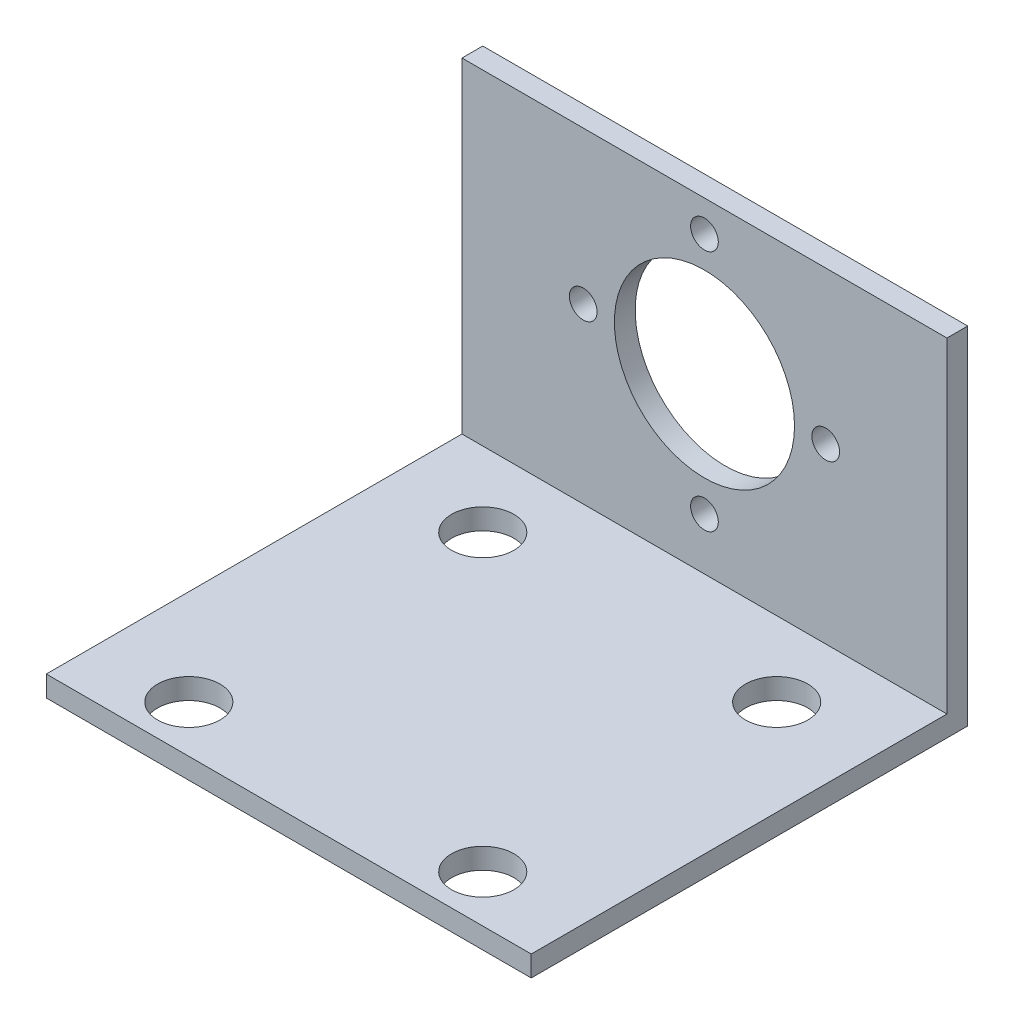
ISO-10303-21;
HEADER;
FILE_DESCRIPTION(('STEP AP214'),'2;1');
FILE_NAME('part.step','',(''),(''),'','','');
FILE_SCHEMA(('AUTOMOTIVE_DESIGN { 1 0 10303 214 1 1 1 1 }'));
ENDSEC;
DATA;
#1=APPLICATION_CONTEXT('core data for automotive mechanical design processes');
#2=APPLICATION_PROTOCOL_DEFINITION('international standard','automotive_design',2000,#1);
#3=PRODUCT_CONTEXT('',#1,'mechanical');
#4=PRODUCT('Part','Part','',(#3));
#5=PRODUCT_RELATED_PRODUCT_CATEGORY('part','',(#4));
#6=PRODUCT_DEFINITION_FORMATION('','',#4);
#7=PRODUCT_DEFINITION_CONTEXT('part definition',#1,'design');
#8=PRODUCT_DEFINITION('design','',#6,#7);
#9=PRODUCT_DEFINITION_SHAPE('','',#8);
#10=(LENGTH_UNIT() NAMED_UNIT(*) SI_UNIT(.MILLI.,.METRE.));
#11=(NAMED_UNIT(*) PLANE_ANGLE_UNIT() SI_UNIT($,.RADIAN.));
#12=(NAMED_UNIT(*) SI_UNIT($,.STERADIAN.) SOLID_ANGLE_UNIT());
#13=UNCERTAINTY_MEASURE_WITH_UNIT(LENGTH_MEASURE(1.E-05),#10,'distance_accuracy_value','');
#14=(GEOMETRIC_REPRESENTATION_CONTEXT(3) GLOBAL_UNCERTAINTY_ASSIGNED_CONTEXT((#13)) GLOBAL_UNIT_ASSIGNED_CONTEXT((#10,
#11,#12)) REPRESENTATION_CONTEXT('',''));
#15=CARTESIAN_POINT('',(0.,0.,0.));
#16=DIRECTION('',(0.,0.,1.));
#17=DIRECTION('',(1.,0.,0.));
#18=AXIS2_PLACEMENT_3D('',#15,#16,#17);
#19=CARTESIAN_POINT('',(0.,0.,3.));
#20=DIRECTION('',(0.,0.,1.));
#21=DIRECTION('',(1.,0.,0.));
#22=AXIS2_PLACEMENT_3D('',#19,#20,#21);
#23=PLANE('',#22);
#24=DIRECTION('',(-1.,0.,0.));
#25=VECTOR('',#24,1.);
#26=CARTESIAN_POINT('',(-35.,-25.,3.));
#27=LINE('',#26,#25);
#28=CARTESIAN_POINT('',(35.,-25.,3.));
#29=VERTEX_POINT('',#28);
#30=CARTESIAN_POINT('',(-35.,-25.,3.));
#31=VERTEX_POINT('',#30);
#32=EDGE_CURVE('E50',#29,#31,#27,.T.);
#33=ORIENTED_EDGE('',*,*,#32,.F.);
#34=DIRECTION('',(0.,1.,0.));
#35=VECTOR('',#34,1.);
#36=CARTESIAN_POINT('',(35.,22.,3.));
#37=LINE('',#36,#35);
#38=CARTESIAN_POINT('',(35.,22.,3.));
#39=VERTEX_POINT('',#38);
#40=EDGE_CURVE('E100',#29,#39,#37,.T.);
#41=ORIENTED_EDGE('',*,*,#40,.T.);
#42=DIRECTION('',(-1.,0.,0.));
#43=VECTOR('',#42,1.);
#44=CARTESIAN_POINT('',(-35.,22.,3.));
#45=LINE('',#44,#43);
#46=CARTESIAN_POINT('',(-35.,22.,3.));
#47=VERTEX_POINT('',#46);
#48=EDGE_CURVE('E56',#39,#47,#45,.T.);
#49=ORIENTED_EDGE('',*,*,#48,.T.);
#50=DIRECTION('',(0.,-1.,0.));
#51=VECTOR('',#50,1.);
#52=CARTESIAN_POINT('',(-35.,22.,3.));
#53=LINE('',#52,#51);
#54=EDGE_CURVE('E94',#47,#31,#53,.T.);
#55=ORIENTED_EDGE('',*,*,#54,.T.);
#56=EDGE_LOOP('',(#33,#41,#49,#55));
#57=FACE_BOUND('',#56,.T.);
#58=CARTESIAN_POINT('',(9.88330434368617E-13,-17.5,3.));
#59=DIRECTION('',(0.,0.,1.));
#60=DIRECTION('',(1.,0.,0.));
#61=AXIS2_PLACEMENT_3D('',#58,#59,#60);
#62=CIRCLE('',#61,2.00000000000106);
#63=CARTESIAN_POINT('',(2.00000000000205,-17.5,3.));
#64=VERTEX_POINT('',#63);
#65=EDGE_CURVE('E134',#64,#64,#62,.T.);
#66=ORIENTED_EDGE('',*,*,#65,.F.);
#67=EDGE_LOOP('',(#66));
#68=FACE_BOUND('',#67,.T.);
#69=CARTESIAN_POINT('',(0.,17.5,3.));
#70=DIRECTION('',(0.,0.,1.));
#71=DIRECTION('',(1.,0.,0.));
#72=AXIS2_PLACEMENT_3D('',#69,#70,#71);
#73=CIRCLE('',#72,2.);
#74=CARTESIAN_POINT('',(2.,17.5,3.));
#75=VERTEX_POINT('',#74);
#76=EDGE_CURVE('E122',#75,#75,#73,.T.);
#77=ORIENTED_EDGE('',*,*,#76,.F.);
#78=EDGE_LOOP('',(#77));
#79=FACE_BOUND('',#78,.T.);
#80=CARTESIAN_POINT('',(0.,0.,3.));
#81=DIRECTION('',(0.,0.,1.));
#82=DIRECTION('',(1.,0.,0.));
#83=AXIS2_PLACEMENT_3D('',#80,#81,#82);
#84=CIRCLE('',#83,13.);
#85=CARTESIAN_POINT('',(13.,0.,3.));
#86=VERTEX_POINT('',#85);
#87=EDGE_CURVE('E85',#86,#86,#84,.T.);
#88=ORIENTED_EDGE('',*,*,#87,.F.);
#89=EDGE_LOOP('',(#88));
#90=FACE_BOUND('',#89,.T.);
#91=CARTESIAN_POINT('',(17.5000000000005,4.94165217184309E-13,3.));
#92=DIRECTION('',(0.,0.,1.));
#93=DIRECTION('',(1.,0.,0.));
#94=AXIS2_PLACEMENT_3D('',#91,#92,#93);
#95=CIRCLE('',#94,2.00000000000039);
#96=CARTESIAN_POINT('',(19.5000000000009,4.94165217184309E-13,3.));
#97=VERTEX_POINT('',#96);
#98=EDGE_CURVE('E128',#97,#97,#95,.T.);
#99=ORIENTED_EDGE('',*,*,#98,.F.);
#100=EDGE_LOOP('',(#99));
#101=FACE_BOUND('',#100,.T.);
#102=CARTESIAN_POINT('',(-17.4999999999995,-4.96308349082816E-13,3.));
#103=DIRECTION('',(0.,0.,1.));
#104=DIRECTION('',(1.,0.,0.));
#105=AXIS2_PLACEMENT_3D('',#102,#103,#104);
#106=CIRCLE('',#105,2.00000000000079);
#107=CARTESIAN_POINT('',(-15.4999999999987,-4.96308349082816E-13,3.));
#108=VERTEX_POINT('',#107);
#109=EDGE_CURVE('E140',#108,#108,#106,.T.);
#110=ORIENTED_EDGE('',*,*,#109,.F.);
#111=EDGE_LOOP('',(#110));
#112=FACE_BOUND('',#111,.T.);
#113=ADVANCED_FACE('F35',(#57,#68,#79,#90,#101,#112),#23,.T.);
#114=CARTESIAN_POINT('',(0.,0.,0.));
#115=DIRECTION('',(0.,0.,1.));
#116=DIRECTION('',(1.,0.,0.));
#117=AXIS2_PLACEMENT_3D('',#114,#115,#116);
#118=PLANE('',#117);
#119=DIRECTION('',(0.,-1.,0.));
#120=VECTOR('',#119,1.);
#121=CARTESIAN_POINT('',(-35.,0.,0.));
#122=LINE('',#121,#120);
#123=CARTESIAN_POINT('',(-35.,22.,0.));
#124=VERTEX_POINT('',#123);
#125=CARTESIAN_POINT('',(-35.,-28.,0.));
#126=VERTEX_POINT('',#125);
#127=EDGE_CURVE('E75',#124,#126,#122,.T.);
#128=ORIENTED_EDGE('',*,*,#127,.F.);
#129=DIRECTION('',(-1.,0.,0.));
#130=VECTOR('',#129,1.);
#131=CARTESIAN_POINT('',(-35.,22.,0.));
#132=LINE('',#131,#130);
#133=CARTESIAN_POINT('',(35.,22.,0.));
#134=VERTEX_POINT('',#133);
#135=EDGE_CURVE('E80',#134,#124,#132,.T.);
#136=ORIENTED_EDGE('',*,*,#135,.F.);
#137=DIRECTION('',(0.,1.,0.));
#138=VECTOR('',#137,1.);
#139=CARTESIAN_POINT('',(35.,22.,0.));
#140=LINE('',#139,#138);
#141=CARTESIAN_POINT('',(35.,-28.,0.));
#142=VERTEX_POINT('',#141);
#143=EDGE_CURVE('E95',#142,#134,#140,.T.);
#144=ORIENTED_EDGE('',*,*,#143,.F.);
#145=DIRECTION('',(1.,0.,0.));
#146=VECTOR('',#145,1.);
#147=CARTESIAN_POINT('',(-35.,-28.,0.));
#148=LINE('',#147,#146);
#149=EDGE_CURVE('E81',#126,#142,#148,.T.);
#150=ORIENTED_EDGE('',*,*,#149,.F.);
#151=EDGE_LOOP('',(#128,#136,#144,#150));
#152=FACE_BOUND('',#151,.T.);
#153=CARTESIAN_POINT('',(0.,0.,0.));
#154=DIRECTION('',(0.,0.,1.));
#155=DIRECTION('',(1.,0.,0.));
#156=AXIS2_PLACEMENT_3D('',#153,#154,#155);
#157=CIRCLE('',#156,13.);
#158=CARTESIAN_POINT('',(13.,0.,0.));
#159=VERTEX_POINT('',#158);
#160=EDGE_CURVE('E119',#159,#159,#157,.T.);
#161=ORIENTED_EDGE('',*,*,#160,.T.);
#162=EDGE_LOOP('',(#161));
#163=FACE_BOUND('',#162,.T.);
#164=CARTESIAN_POINT('',(0.,17.5,0.));
#165=DIRECTION('',(0.,0.,1.));
#166=DIRECTION('',(1.,0.,0.));
#167=AXIS2_PLACEMENT_3D('',#164,#165,#166);
#168=CIRCLE('',#167,2.);
#169=CARTESIAN_POINT('',(2.,17.5,0.));
#170=VERTEX_POINT('',#169);
#171=EDGE_CURVE('E125',#170,#170,#168,.T.);
#172=ORIENTED_EDGE('',*,*,#171,.T.);
#173=EDGE_LOOP('',(#172));
#174=FACE_BOUND('',#173,.T.);
#175=CARTESIAN_POINT('',(17.5000000000005,4.94165217184309E-13,0.));
#176=DIRECTION('',(0.,0.,1.));
#177=DIRECTION('',(1.,0.,0.));
#178=AXIS2_PLACEMENT_3D('',#175,#176,#177);
#179=CIRCLE('',#178,2.00000000000039);
#180=CARTESIAN_POINT('',(19.5000000000009,4.94165217184309E-13,0.));
#181=VERTEX_POINT('',#180);
#182=EDGE_CURVE('E131',#181,#181,#179,.T.);
#183=ORIENTED_EDGE('',*,*,#182,.T.);
#184=EDGE_LOOP('',(#183));
#185=FACE_BOUND('',#184,.T.);
#186=CARTESIAN_POINT('',(9.88330434368617E-13,-17.5,0.));
#187=DIRECTION('',(0.,0.,1.));
#188=DIRECTION('',(1.,0.,0.));
#189=AXIS2_PLACEMENT_3D('',#186,#187,#188);
#190=CIRCLE('',#189,2.00000000000106);
#191=CARTESIAN_POINT('',(2.00000000000205,-17.5,0.));
#192=VERTEX_POINT('',#191);
#193=EDGE_CURVE('E137',#192,#192,#190,.T.);
#194=ORIENTED_EDGE('',*,*,#193,.T.);
#195=EDGE_LOOP('',(#194));
#196=FACE_BOUND('',#195,.T.);
#197=CARTESIAN_POINT('',(-17.4999999999995,-4.96308349082816E-13,0.));
#198=DIRECTION('',(0.,0.,1.));
#199=DIRECTION('',(1.,0.,0.));
#200=AXIS2_PLACEMENT_3D('',#197,#198,#199);
#201=CIRCLE('',#200,2.00000000000079);
#202=CARTESIAN_POINT('',(-15.4999999999987,-4.96308349082816E-13,0.));
#203=VERTEX_POINT('',#202);
#204=EDGE_CURVE('E143',#203,#203,#201,.T.);
#205=ORIENTED_EDGE('',*,*,#204,.T.);
#206=EDGE_LOOP('',(#205));
#207=FACE_BOUND('',#206,.T.);
#208=ADVANCED_FACE('F77',(#152,#163,#174,#185,#196,#207),#118,.F.);
#209=CARTESIAN_POINT('',(-35.,0.,3.));
#210=DIRECTION('',(1.,0.,0.));
#211=DIRECTION('',(0.,0.,-1.));
#212=AXIS2_PLACEMENT_3D('',#209,#210,#211);
#213=PLANE('',#212);
#214=ORIENTED_EDGE('',*,*,#127,.T.);
#215=DIRECTION('',(0.,0.,-1.));
#216=VECTOR('',#215,1.);
#217=CARTESIAN_POINT('',(-35.,-28.,3.));
#218=LINE('',#217,#216);
#219=CARTESIAN_POINT('',(-35.,-28.,63.));
#220=VERTEX_POINT('',#219);
#221=EDGE_CURVE('E11',#220,#126,#218,.T.);
#222=ORIENTED_EDGE('',*,*,#221,.F.);
#223=DIRECTION('',(0.,-1.,0.));
#224=VECTOR('',#223,1.);
#225=CARTESIAN_POINT('',(-35.,-28.,63.));
#226=LINE('',#225,#224);
#227=CARTESIAN_POINT('',(-35.,-25.,63.));
#228=VERTEX_POINT('',#227);
#229=EDGE_CURVE('E155',#228,#220,#226,.T.);
#230=ORIENTED_EDGE('',*,*,#229,.F.);
#231=DIRECTION('',(0.,0.,-1.));
#232=VECTOR('',#231,1.);
#233=CARTESIAN_POINT('',(-35.,-25.,63.));
#234=LINE('',#233,#232);
#235=EDGE_CURVE('E151',#228,#31,#234,.T.);
#236=ORIENTED_EDGE('',*,*,#235,.T.);
#237=ORIENTED_EDGE('',*,*,#54,.F.);
#238=DIRECTION('',(0.,0.,-1.));
#239=VECTOR('',#238,1.);
#240=CARTESIAN_POINT('',(-35.,22.,3.));
#241=LINE('',#240,#239);
#242=EDGE_CURVE('E90',#47,#124,#241,.T.);
#243=ORIENTED_EDGE('',*,*,#242,.T.);
#244=EDGE_LOOP('',(#214,#222,#230,#236,#237,#243));
#245=FACE_BOUND('',#244,.T.);
#246=ADVANCED_FACE('F37',(#245),#213,.F.);
#247=CARTESIAN_POINT('',(-35.,-28.,3.));
#248=DIRECTION('',(0.,1.,0.));
#249=DIRECTION('',(-1.,0.,0.));
#250=AXIS2_PLACEMENT_3D('',#247,#248,#249);
#251=PLANE('',#250);
#252=CARTESIAN_POINT('',(-21.2132034355962,-28.,13.7867965644045));
#253=DIRECTION('',(0.,1.,0.));
#254=DIRECTION('',(0.,0.,1.));
#255=AXIS2_PLACEMENT_3D('',#252,#253,#254);
#256=CIRCLE('',#255,4.5);
#257=CARTESIAN_POINT('',(-21.2132034355962,-28.,18.2867965644045));
#258=VERTEX_POINT('',#257);
#259=EDGE_CURVE('E173',#258,#258,#256,.T.);
#260=ORIENTED_EDGE('',*,*,#259,.T.);
#261=EDGE_LOOP('',(#260));
#262=FACE_BOUND('',#261,.T.);
#263=CARTESIAN_POINT('',(-21.2132034355954,-28.,56.2132034355974));
#264=DIRECTION('',(0.,1.,0.));
#265=DIRECTION('',(0.,0.,1.));
#266=AXIS2_PLACEMENT_3D('',#263,#264,#265);
#267=CIRCLE('',#266,4.5);
#268=CARTESIAN_POINT('',(-21.2132034355954,-28.,60.7132034355974));
#269=VERTEX_POINT('',#268);
#270=EDGE_CURVE('E179',#269,#269,#267,.T.);
#271=ORIENTED_EDGE('',*,*,#270,.T.);
#272=EDGE_LOOP('',(#271));
#273=FACE_BOUND('',#272,.T.);
#274=CARTESIAN_POINT('',(21.2132034355975,-28.,56.2132034355965));
#275=DIRECTION('',(0.,1.,0.));
#276=DIRECTION('',(0.,0.,1.));
#277=AXIS2_PLACEMENT_3D('',#274,#275,#276);
#278=CIRCLE('',#277,4.5);
#279=CARTESIAN_POINT('',(21.2132034355975,-28.,60.7132034355965));
#280=VERTEX_POINT('',#279);
#281=EDGE_CURVE('E167',#280,#280,#278,.T.);
#282=ORIENTED_EDGE('',*,*,#281,.T.);
#283=EDGE_LOOP('',(#282));
#284=FACE_BOUND('',#283,.T.);
#285=CARTESIAN_POINT('',(21.2132034355964,-28.,13.7867965644036));
#286=DIRECTION('',(0.,1.,0.));
#287=DIRECTION('',(0.,0.,1.));
#288=AXIS2_PLACEMENT_3D('',#285,#286,#287);
#289=CIRCLE('',#288,4.5);
#290=CARTESIAN_POINT('',(21.2132034355964,-28.,18.2867965644036));
#291=VERTEX_POINT('',#290);
#292=EDGE_CURVE('E156',#291,#291,#289,.T.);
#293=ORIENTED_EDGE('',*,*,#292,.T.);
#294=EDGE_LOOP('',(#293));
#295=FACE_BOUND('',#294,.T.);
#296=ORIENTED_EDGE('',*,*,#149,.T.);
#297=DIRECTION('',(0.,0.,-1.));
#298=VECTOR('',#297,1.);
#299=CARTESIAN_POINT('',(35.,-28.,3.));
#300=LINE('',#299,#298);
#301=CARTESIAN_POINT('',(35.,-28.,63.));
#302=VERTEX_POINT('',#301);
#303=EDGE_CURVE('E43',#302,#142,#300,.T.);
#304=ORIENTED_EDGE('',*,*,#303,.F.);
#305=DIRECTION('',(1.,0.,0.));
#306=VECTOR('',#305,1.);
#307=CARTESIAN_POINT('',(-35.,-28.,63.));
#308=LINE('',#307,#306);
#309=EDGE_CURVE('E160',#220,#302,#308,.T.);
#310=ORIENTED_EDGE('',*,*,#309,.F.);
#311=ORIENTED_EDGE('',*,*,#221,.T.);
#312=EDGE_LOOP('',(#296,#304,#310,#311));
#313=FACE_BOUND('',#312,.T.);
#314=ADVANCED_FACE('F188',(#262,#273,#284,#295,#313),#251,.F.);
#315=CARTESIAN_POINT('',(35.,22.,3.));
#316=DIRECTION('',(-1.,0.,0.));
#317=DIRECTION('',(0.,-1.,0.));
#318=AXIS2_PLACEMENT_3D('',#315,#316,#317);
#319=PLANE('',#318);
#320=ORIENTED_EDGE('',*,*,#143,.T.);
#321=DIRECTION('',(0.,0.,-1.));
#322=VECTOR('',#321,1.);
#323=CARTESIAN_POINT('',(35.,22.,3.));
#324=LINE('',#323,#322);
#325=EDGE_CURVE('E93',#39,#134,#324,.T.);
#326=ORIENTED_EDGE('',*,*,#325,.F.);
#327=ORIENTED_EDGE('',*,*,#40,.F.);
#328=DIRECTION('',(0.,0.,-1.));
#329=VECTOR('',#328,1.);
#330=CARTESIAN_POINT('',(35.,-25.,63.));
#331=LINE('',#330,#329);
#332=CARTESIAN_POINT('',(35.,-25.,63.));
#333=VERTEX_POINT('',#332);
#334=EDGE_CURVE('E146',#333,#29,#331,.T.);
#335=ORIENTED_EDGE('',*,*,#334,.F.);
#336=DIRECTION('',(0.,1.,0.));
#337=VECTOR('',#336,1.);
#338=CARTESIAN_POINT('',(35.,-28.,63.));
#339=LINE('',#338,#337);
#340=EDGE_CURVE('E111',#302,#333,#339,.T.);
#341=ORIENTED_EDGE('',*,*,#340,.F.);
#342=ORIENTED_EDGE('',*,*,#303,.T.);
#343=EDGE_LOOP('',(#320,#326,#327,#335,#341,#342));
#344=FACE_BOUND('',#343,.T.);
#345=ADVANCED_FACE('F107',(#344),#319,.F.);
#346=CARTESIAN_POINT('',(-35.,22.,3.));
#347=DIRECTION('',(0.,-1.,0.));
#348=DIRECTION('',(1.,0.,0.));
#349=AXIS2_PLACEMENT_3D('',#346,#347,#348);
#350=PLANE('',#349);
#351=ORIENTED_EDGE('',*,*,#135,.T.);
#352=ORIENTED_EDGE('',*,*,#242,.F.);
#353=ORIENTED_EDGE('',*,*,#48,.F.);
#354=ORIENTED_EDGE('',*,*,#325,.T.);
#355=EDGE_LOOP('',(#351,#352,#353,#354));
#356=FACE_BOUND('',#355,.T.);
#357=ADVANCED_FACE('F89',(#356),#350,.F.);
#358=CARTESIAN_POINT('',(0.,0.,3.));
#359=DIRECTION('',(0.,0.,-1.));
#360=DIRECTION('',(-1.,0.,0.));
#361=AXIS2_PLACEMENT_3D('',#358,#359,#360);
#362=CYLINDRICAL_SURFACE('',#361,13.);
#363=ORIENTED_EDGE('',*,*,#87,.T.);
#364=EDGE_LOOP('',(#363));
#365=FACE_BOUND('',#364,.T.);
#366=ORIENTED_EDGE('',*,*,#160,.F.);
#367=EDGE_LOOP('',(#366));
#368=FACE_BOUND('',#367,.T.);
#369=ADVANCED_FACE('F247',(#365,#368),#362,.F.);
#370=CARTESIAN_POINT('',(0.,17.5,3.));
#371=DIRECTION('',(0.,0.,-1.));
#372=DIRECTION('',(-1.,0.,0.));
#373=AXIS2_PLACEMENT_3D('',#370,#371,#372);
#374=CYLINDRICAL_SURFACE('',#373,2.);
#375=ORIENTED_EDGE('',*,*,#76,.T.);
#376=EDGE_LOOP('',(#375));
#377=FACE_BOUND('',#376,.T.);
#378=ORIENTED_EDGE('',*,*,#171,.F.);
#379=EDGE_LOOP('',(#378));
#380=FACE_BOUND('',#379,.T.);
#381=ADVANCED_FACE('F280',(#377,#380),#374,.F.);
#382=CARTESIAN_POINT('',(17.5000000000005,4.94165217184309E-13,3.));
#383=DIRECTION('',(0.,0.,-1.));
#384=DIRECTION('',(-1.,0.,0.));
#385=AXIS2_PLACEMENT_3D('',#382,#383,#384);
#386=CYLINDRICAL_SURFACE('',#385,2.00000000000039);
#387=ORIENTED_EDGE('',*,*,#98,.T.);
#388=EDGE_LOOP('',(#387));
#389=FACE_BOUND('',#388,.T.);
#390=ORIENTED_EDGE('',*,*,#182,.F.);
#391=EDGE_LOOP('',(#390));
#392=FACE_BOUND('',#391,.T.);
#393=ADVANCED_FACE('F276',(#389,#392),#386,.F.);
#394=CARTESIAN_POINT('',(9.88330434368617E-13,-17.5,3.));
#395=DIRECTION('',(0.,0.,-1.));
#396=DIRECTION('',(-1.,0.,0.));
#397=AXIS2_PLACEMENT_3D('',#394,#395,#396);
#398=CYLINDRICAL_SURFACE('',#397,2.00000000000106);
#399=ORIENTED_EDGE('',*,*,#65,.T.);
#400=EDGE_LOOP('',(#399));
#401=FACE_BOUND('',#400,.T.);
#402=ORIENTED_EDGE('',*,*,#193,.F.);
#403=EDGE_LOOP('',(#402));
#404=FACE_BOUND('',#403,.T.);
#405=ADVANCED_FACE('F234',(#401,#404),#398,.F.);
#406=CARTESIAN_POINT('',(-17.4999999999995,-4.96308349082816E-13,3.));
#407=DIRECTION('',(0.,0.,-1.));
#408=DIRECTION('',(-1.,0.,0.));
#409=AXIS2_PLACEMENT_3D('',#406,#407,#408);
#410=CYLINDRICAL_SURFACE('',#409,2.00000000000079);
#411=ORIENTED_EDGE('',*,*,#109,.T.);
#412=EDGE_LOOP('',(#411));
#413=FACE_BOUND('',#412,.T.);
#414=ORIENTED_EDGE('',*,*,#204,.F.);
#415=EDGE_LOOP('',(#414));
#416=FACE_BOUND('',#415,.T.);
#417=ADVANCED_FACE('F203',(#413,#416),#410,.F.);
#418=CARTESIAN_POINT('',(-35.,-25.,63.));
#419=DIRECTION('',(0.,-1.,0.));
#420=DIRECTION('',(0.,0.,-1.));
#421=AXIS2_PLACEMENT_3D('',#418,#419,#420);
#422=PLANE('',#421);
#423=CARTESIAN_POINT('',(-21.2132034355962,-25.,13.7867965644045));
#424=DIRECTION('',(0.,1.,0.));
#425=DIRECTION('',(0.,0.,1.));
#426=AXIS2_PLACEMENT_3D('',#423,#424,#425);
#427=CIRCLE('',#426,4.5);
#428=CARTESIAN_POINT('',(-21.2132034355962,-25.,18.2867965644045));
#429=VERTEX_POINT('',#428);
#430=EDGE_CURVE('E170',#429,#429,#427,.T.);
#431=ORIENTED_EDGE('',*,*,#430,.F.);
#432=EDGE_LOOP('',(#431));
#433=FACE_BOUND('',#432,.T.);
#434=CARTESIAN_POINT('',(-21.2132034355954,-25.,56.2132034355974));
#435=DIRECTION('',(0.,1.,0.));
#436=DIRECTION('',(0.,0.,1.));
#437=AXIS2_PLACEMENT_3D('',#434,#435,#436);
#438=CIRCLE('',#437,4.5);
#439=CARTESIAN_POINT('',(-21.2132034355954,-25.,60.7132034355974));
#440=VERTEX_POINT('',#439);
#441=EDGE_CURVE('E176',#440,#440,#438,.T.);
#442=ORIENTED_EDGE('',*,*,#441,.F.);
#443=EDGE_LOOP('',(#442));
#444=FACE_BOUND('',#443,.T.);
#445=CARTESIAN_POINT('',(21.2132034355975,-25.,56.2132034355965));
#446=DIRECTION('',(0.,1.,0.));
#447=DIRECTION('',(0.,0.,1.));
#448=AXIS2_PLACEMENT_3D('',#445,#446,#447);
#449=CIRCLE('',#448,4.5);
#450=CARTESIAN_POINT('',(21.2132034355975,-25.,60.7132034355965));
#451=VERTEX_POINT('',#450);
#452=EDGE_CURVE('E182',#451,#451,#449,.T.);
#453=ORIENTED_EDGE('',*,*,#452,.F.);
#454=EDGE_LOOP('',(#453));
#455=FACE_BOUND('',#454,.T.);
#456=CARTESIAN_POINT('',(21.2132034355964,-25.,13.7867965644036));
#457=DIRECTION('',(0.,1.,0.));
#458=DIRECTION('',(0.,0.,1.));
#459=AXIS2_PLACEMENT_3D('',#456,#457,#458);
#460=CIRCLE('',#459,4.5);
#461=CARTESIAN_POINT('',(21.2132034355964,-25.,18.2867965644036));
#462=VERTEX_POINT('',#461);
#463=EDGE_CURVE('E164',#462,#462,#460,.T.);
#464=ORIENTED_EDGE('',*,*,#463,.F.);
#465=EDGE_LOOP('',(#464));
#466=FACE_BOUND('',#465,.T.);
#467=ORIENTED_EDGE('',*,*,#32,.T.);
#468=ORIENTED_EDGE('',*,*,#235,.F.);
#469=DIRECTION('',(-1.,0.,0.));
#470=VECTOR('',#469,1.);
#471=CARTESIAN_POINT('',(-35.,-25.,63.));
#472=LINE('',#471,#470);
#473=EDGE_CURVE('E153',#333,#228,#472,.T.);
#474=ORIENTED_EDGE('',*,*,#473,.F.);
#475=ORIENTED_EDGE('',*,*,#334,.T.);
#476=EDGE_LOOP('',(#467,#468,#474,#475));
#477=FACE_BOUND('',#476,.T.);
#478=ADVANCED_FACE('F199',(#433,#444,#455,#466,#477),#422,.F.);
#479=CARTESIAN_POINT('',(0.,0.,63.));
#480=DIRECTION('',(0.,0.,-1.));
#481=DIRECTION('',(-1.,0.,0.));
#482=AXIS2_PLACEMENT_3D('',#479,#480,#481);
#483=PLANE('',#482);
#484=ORIENTED_EDGE('',*,*,#229,.T.);
#485=ORIENTED_EDGE('',*,*,#309,.T.);
#486=ORIENTED_EDGE('',*,*,#340,.T.);
#487=ORIENTED_EDGE('',*,*,#473,.T.);
#488=EDGE_LOOP('',(#484,#485,#486,#487));
#489=FACE_BOUND('',#488,.T.);
#490=ADVANCED_FACE('F202',(#489),#483,.F.);
#491=CARTESIAN_POINT('',(21.2132034355964,-28.,13.7867965644036));
#492=DIRECTION('',(0.,1.,0.));
#493=DIRECTION('',(0.,0.,1.));
#494=AXIS2_PLACEMENT_3D('',#491,#492,#493);
#495=CYLINDRICAL_SURFACE('',#494,4.5);
#496=ORIENTED_EDGE('',*,*,#292,.F.);
#497=EDGE_LOOP('',(#496));
#498=FACE_BOUND('',#497,.T.);
#499=ORIENTED_EDGE('',*,*,#463,.T.);
#500=EDGE_LOOP('',(#499));
#501=FACE_BOUND('',#500,.T.);
#502=ADVANCED_FACE('F195',(#498,#501),#495,.F.);
#503=CARTESIAN_POINT('',(21.2132034355975,-28.,56.2132034355965));
#504=DIRECTION('',(0.,1.,0.));
#505=DIRECTION('',(0.,0.,1.));
#506=AXIS2_PLACEMENT_3D('',#503,#504,#505);
#507=CYLINDRICAL_SURFACE('',#506,4.5);
#508=ORIENTED_EDGE('',*,*,#281,.F.);
#509=EDGE_LOOP('',(#508));
#510=FACE_BOUND('',#509,.T.);
#511=ORIENTED_EDGE('',*,*,#452,.T.);
#512=EDGE_LOOP('',(#511));
#513=FACE_BOUND('',#512,.T.);
#514=ADVANCED_FACE('F191',(#510,#513),#507,.F.);
#515=CARTESIAN_POINT('',(-21.2132034355954,-28.,56.2132034355974));
#516=DIRECTION('',(0.,1.,0.));
#517=DIRECTION('',(0.,0.,1.));
#518=AXIS2_PLACEMENT_3D('',#515,#516,#517);
#519=CYLINDRICAL_SURFACE('',#518,4.5);
#520=ORIENTED_EDGE('',*,*,#270,.F.);
#521=EDGE_LOOP('',(#520));
#522=FACE_BOUND('',#521,.T.);
#523=ORIENTED_EDGE('',*,*,#441,.T.);
#524=EDGE_LOOP('',(#523));
#525=FACE_BOUND('',#524,.T.);
#526=ADVANCED_FACE('F194',(#522,#525),#519,.F.);
#527=CARTESIAN_POINT('',(-21.2132034355962,-28.,13.7867965644045));
#528=DIRECTION('',(0.,1.,0.));
#529=DIRECTION('',(0.,0.,1.));
#530=AXIS2_PLACEMENT_3D('',#527,#528,#529);
#531=CYLINDRICAL_SURFACE('',#530,4.5);
#532=ORIENTED_EDGE('',*,*,#259,.F.);
#533=EDGE_LOOP('',(#532));
#534=FACE_BOUND('',#533,.T.);
#535=ORIENTED_EDGE('',*,*,#430,.T.);
#536=EDGE_LOOP('',(#535));
#537=FACE_BOUND('',#536,.T.);
#538=ADVANCED_FACE('F259',(#534,#537),#531,.F.);
#539=CLOSED_SHELL('',(#113,#208,#246,#314,#345,#357,#369,#381,#393,#405,#417,#478,#490,#502,
#514,#526,#538));
#540=MANIFOLD_SOLID_BREP('B2',#539);
#541=ADVANCED_BREP_SHAPE_REPRESENTATION('',(#18,#540),#14);
#542=SHAPE_DEFINITION_REPRESENTATION(#9,#541);
ENDSEC;
END-ISO-10303-21;
